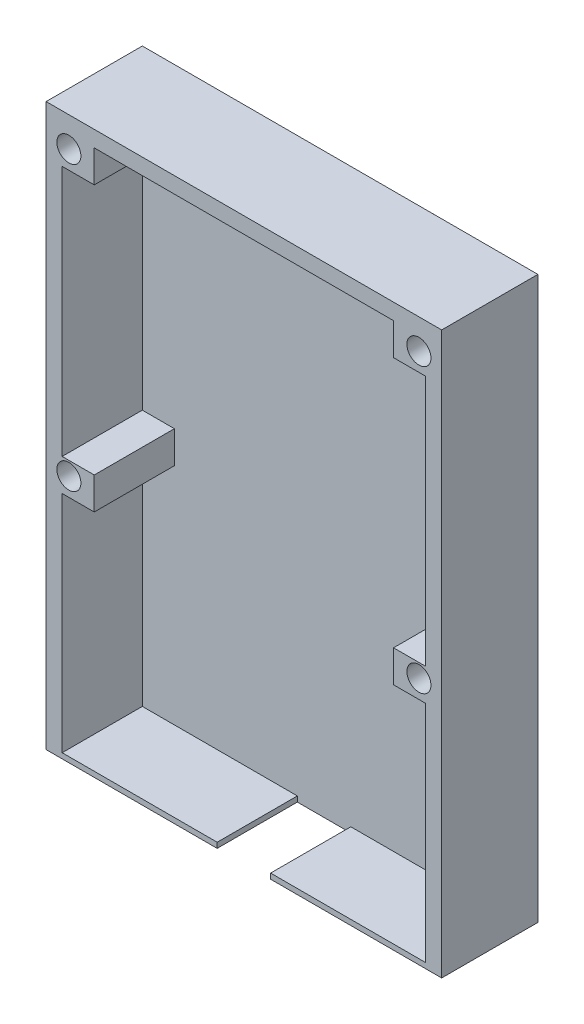
ISO-10303-21;
HEADER;
FILE_DESCRIPTION(('STEP AP214'),'2;1');
FILE_NAME('part.step','',(''),(''),'','','');
FILE_SCHEMA(('AUTOMOTIVE_DESIGN { 1 0 10303 214 1 1 1 1 }'));
ENDSEC;
DATA;
#1=APPLICATION_CONTEXT('core data for automotive mechanical design processes');
#2=APPLICATION_PROTOCOL_DEFINITION('international standard','automotive_design',2000,#1);
#3=PRODUCT_CONTEXT('',#1,'mechanical');
#4=PRODUCT('Part','Part','',(#3));
#5=PRODUCT_RELATED_PRODUCT_CATEGORY('part','',(#4));
#6=PRODUCT_DEFINITION_FORMATION('','',#4);
#7=PRODUCT_DEFINITION_CONTEXT('part definition',#1,'design');
#8=PRODUCT_DEFINITION('design','',#6,#7);
#9=PRODUCT_DEFINITION_SHAPE('','',#8);
#10=(LENGTH_UNIT() NAMED_UNIT(*) SI_UNIT(.MILLI.,.METRE.));
#11=(NAMED_UNIT(*) PLANE_ANGLE_UNIT() SI_UNIT($,.RADIAN.));
#12=(NAMED_UNIT(*) SI_UNIT($,.STERADIAN.) SOLID_ANGLE_UNIT());
#13=UNCERTAINTY_MEASURE_WITH_UNIT(LENGTH_MEASURE(1.E-05),#10,'distance_accuracy_value','');
#14=(GEOMETRIC_REPRESENTATION_CONTEXT(3) GLOBAL_UNCERTAINTY_ASSIGNED_CONTEXT((#13)) GLOBAL_UNIT_ASSIGNED_CONTEXT((#10,
#11,#12)) REPRESENTATION_CONTEXT('',''));
#15=CARTESIAN_POINT('',(0.,0.,0.));
#16=DIRECTION('',(0.,0.,1.));
#17=DIRECTION('',(1.,0.,0.));
#18=AXIS2_PLACEMENT_3D('',#15,#16,#17);
#19=CARTESIAN_POINT('',(0.,0.,18.));
#20=DIRECTION('',(0.,0.,-1.));
#21=DIRECTION('',(-1.,0.,0.));
#22=AXIS2_PLACEMENT_3D('',#19,#20,#21);
#23=PLANE('',#22);
#24=CARTESIAN_POINT('',(32.7450762059556,46.9267514757554,18.));
#25=DIRECTION('',(0.,0.,1.));
#26=DIRECTION('',(1.,0.,0.));
#27=AXIS2_PLACEMENT_3D('',#24,#25,#26);
#28=CIRCLE('',#27,2.24999999999999);
#29=CARTESIAN_POINT('',(34.9950762059556,46.9267514757554,18.));
#30=VERTEX_POINT('',#29);
#31=EDGE_CURVE('E267',#30,#30,#28,.T.);
#32=ORIENTED_EDGE('',*,*,#31,.F.);
#33=EDGE_LOOP('',(#32));
#34=FACE_BOUND('',#33,.T.);
#35=DIRECTION('',(0.,1.,0.));
#36=VECTOR('',#35,1.);
#37=CARTESIAN_POINT('',(34.,-49.5,18.));
#38=LINE('',#37,#36);
#39=CARTESIAN_POINT('',(34.,-51.5,18.));
#40=VERTEX_POINT('',#39);
#41=CARTESIAN_POINT('',(34.,-9.49999999999999,18.));
#42=VERTEX_POINT('',#41);
#43=EDGE_CURVE('E352',#40,#42,#38,.T.);
#44=ORIENTED_EDGE('',*,*,#43,.F.);
#45=DIRECTION('',(-1.,0.,0.));
#46=VECTOR('',#45,1.);
#47=CARTESIAN_POINT('',(0.,-51.5,18.));
#48=LINE('',#47,#46);
#49=CARTESIAN_POINT('',(5.,-51.5,18.));
#50=VERTEX_POINT('',#49);
#51=EDGE_CURVE('E208',#40,#50,#48,.T.);
#52=ORIENTED_EDGE('',*,*,#51,.T.);
#53=DIRECTION('',(0.,-1.,0.));
#54=VECTOR('',#53,1.);
#55=CARTESIAN_POINT('',(5.,0.,18.));
#56=LINE('',#55,#54);
#57=CARTESIAN_POINT('',(5.,-52.5,18.));
#58=VERTEX_POINT('',#57);
#59=EDGE_CURVE('E323',#50,#58,#56,.T.);
#60=ORIENTED_EDGE('',*,*,#59,.T.);
#61=DIRECTION('',(1.,0.,0.));
#62=VECTOR('',#61,1.);
#63=CARTESIAN_POINT('',(-37.,-52.5,18.));
#64=LINE('',#63,#62);
#65=CARTESIAN_POINT('',(37.,-52.5,18.));
#66=VERTEX_POINT('',#65);
#67=EDGE_CURVE('E370',#58,#66,#64,.T.);
#68=ORIENTED_EDGE('',*,*,#67,.T.);
#69=DIRECTION('',(0.,1.,0.));
#70=VECTOR('',#69,1.);
#71=CARTESIAN_POINT('',(37.,-52.5,18.));
#72=LINE('',#71,#70);
#73=CARTESIAN_POINT('',(37.,52.5,18.));
#74=VERTEX_POINT('',#73);
#75=EDGE_CURVE('E362',#66,#74,#72,.T.);
#76=ORIENTED_EDGE('',*,*,#75,.T.);
#77=DIRECTION('',(-1.,0.,0.));
#78=VECTOR('',#77,1.);
#79=CARTESIAN_POINT('',(-37.,52.5,18.));
#80=LINE('',#79,#78);
#81=CARTESIAN_POINT('',(-37.,52.5,18.));
#82=VERTEX_POINT('',#81);
#83=EDGE_CURVE('E365',#74,#82,#80,.T.);
#84=ORIENTED_EDGE('',*,*,#83,.T.);
#85=DIRECTION('',(0.,-1.,0.));
#86=VECTOR('',#85,1.);
#87=CARTESIAN_POINT('',(-37.,-52.5,18.));
#88=LINE('',#87,#86);
#89=CARTESIAN_POINT('',(-37.,-52.5,18.));
#90=VERTEX_POINT('',#89);
#91=EDGE_CURVE('E368',#82,#90,#88,.T.);
#92=ORIENTED_EDGE('',*,*,#91,.T.);
#93=CARTESIAN_POINT('',(-5.,-52.5,18.));
#94=VERTEX_POINT('',#93);
#95=EDGE_CURVE('E371',#90,#94,#64,.T.);
#96=ORIENTED_EDGE('',*,*,#95,.T.);
#97=DIRECTION('',(0.,1.,0.));
#98=VECTOR('',#97,1.);
#99=CARTESIAN_POINT('',(-5.,0.,18.));
#100=LINE('',#99,#98);
#101=CARTESIAN_POINT('',(-5.,-51.5,18.));
#102=VERTEX_POINT('',#101);
#103=EDGE_CURVE('E319',#94,#102,#100,.T.);
#104=ORIENTED_EDGE('',*,*,#103,.T.);
#105=CARTESIAN_POINT('',(-34.,-51.5,18.));
#106=VERTEX_POINT('',#105);
#107=EDGE_CURVE('E56',#102,#106,#48,.T.);
#108=ORIENTED_EDGE('',*,*,#107,.T.);
#109=DIRECTION('',(0.,-1.,0.));
#110=VECTOR('',#109,1.);
#111=CARTESIAN_POINT('',(-34.,49.5,18.));
#112=LINE('',#111,#110);
#113=CARTESIAN_POINT('',(-34.,-9.49999999999999,18.));
#114=VERTEX_POINT('',#113);
#115=EDGE_CURVE('E357',#114,#106,#112,.T.);
#116=ORIENTED_EDGE('',*,*,#115,.F.);
#117=DIRECTION('',(1.,0.,0.));
#118=VECTOR('',#117,1.);
#119=CARTESIAN_POINT('',(-34.,-9.49999999999999,18.));
#120=LINE('',#119,#118);
#121=CARTESIAN_POINT('',(-28.,-9.49999999999999,18.));
#122=VERTEX_POINT('',#121);
#123=EDGE_CURVE('E229',#114,#122,#120,.T.);
#124=ORIENTED_EDGE('',*,*,#123,.T.);
#125=DIRECTION('',(0.,1.,0.));
#126=VECTOR('',#125,1.);
#127=CARTESIAN_POINT('',(-28.,-3.49999999999999,18.));
#128=LINE('',#127,#126);
#129=CARTESIAN_POINT('',(-28.,-3.49999999999999,18.));
#130=VERTEX_POINT('',#129);
#131=EDGE_CURVE('E238',#122,#130,#128,.T.);
#132=ORIENTED_EDGE('',*,*,#131,.T.);
#133=DIRECTION('',(-1.,0.,0.));
#134=VECTOR('',#133,1.);
#135=CARTESIAN_POINT('',(-34.,-3.50000000000001,18.));
#136=LINE('',#135,#134);
#137=CARTESIAN_POINT('',(-34.,-3.49999999999999,18.));
#138=VERTEX_POINT('',#137);
#139=EDGE_CURVE('E241',#130,#138,#136,.T.);
#140=ORIENTED_EDGE('',*,*,#139,.T.);
#141=CARTESIAN_POINT('',(-34.,43.5,18.));
#142=VERTEX_POINT('',#141);
#143=EDGE_CURVE('E358',#142,#138,#112,.T.);
#144=ORIENTED_EDGE('',*,*,#143,.F.);
#145=DIRECTION('',(1.,0.,0.));
#146=VECTOR('',#145,1.);
#147=CARTESIAN_POINT('',(-34.,43.5,18.));
#148=LINE('',#147,#146);
#149=CARTESIAN_POINT('',(-28.,43.5,18.));
#150=VERTEX_POINT('',#149);
#151=EDGE_CURVE('E331',#142,#150,#148,.T.);
#152=ORIENTED_EDGE('',*,*,#151,.T.);
#153=DIRECTION('',(0.,1.,0.));
#154=VECTOR('',#153,1.);
#155=CARTESIAN_POINT('',(-28.,49.5,18.));
#156=LINE('',#155,#154);
#157=CARTESIAN_POINT('',(-28.,49.5,18.));
#158=VERTEX_POINT('',#157);
#159=EDGE_CURVE('E338',#150,#158,#156,.T.);
#160=ORIENTED_EDGE('',*,*,#159,.T.);
#161=DIRECTION('',(-1.,0.,0.));
#162=VECTOR('',#161,1.);
#163=CARTESIAN_POINT('',(34.,49.5,18.));
#164=LINE('',#163,#162);
#165=CARTESIAN_POINT('',(28.,49.5,18.));
#166=VERTEX_POINT('',#165);
#167=EDGE_CURVE('E348',#166,#158,#164,.T.);
#168=ORIENTED_EDGE('',*,*,#167,.F.);
#169=DIRECTION('',(0.,1.,0.));
#170=VECTOR('',#169,1.);
#171=CARTESIAN_POINT('',(28.,49.5,18.));
#172=LINE('',#171,#170);
#173=CARTESIAN_POINT('',(28.,43.5,18.));
#174=VERTEX_POINT('',#173);
#175=EDGE_CURVE('E291',#174,#166,#172,.T.);
#176=ORIENTED_EDGE('',*,*,#175,.F.);
#177=DIRECTION('',(-1.,0.,0.));
#178=VECTOR('',#177,1.);
#179=CARTESIAN_POINT('',(34.,43.5,18.));
#180=LINE('',#179,#178);
#181=CARTESIAN_POINT('',(34.,43.5,18.));
#182=VERTEX_POINT('',#181);
#183=EDGE_CURVE('E300',#182,#174,#180,.T.);
#184=ORIENTED_EDGE('',*,*,#183,.F.);
#185=CARTESIAN_POINT('',(34.,-3.50000000000001,18.));
#186=VERTEX_POINT('',#185);
#187=EDGE_CURVE('E360',#186,#182,#38,.T.);
#188=ORIENTED_EDGE('',*,*,#187,.F.);
#189=DIRECTION('',(1.,0.,0.));
#190=VECTOR('',#189,1.);
#191=CARTESIAN_POINT('',(34.,-3.50000000000001,18.));
#192=LINE('',#191,#190);
#193=CARTESIAN_POINT('',(28.,-3.49999999999999,18.));
#194=VERTEX_POINT('',#193);
#195=EDGE_CURVE('E260',#194,#186,#192,.T.);
#196=ORIENTED_EDGE('',*,*,#195,.F.);
#197=DIRECTION('',(0.,1.,0.));
#198=VECTOR('',#197,1.);
#199=CARTESIAN_POINT('',(28.,-3.49999999999999,18.));
#200=LINE('',#199,#198);
#201=CARTESIAN_POINT('',(28.,-9.49999999999999,18.));
#202=VERTEX_POINT('',#201);
#203=EDGE_CURVE('E270',#202,#194,#200,.T.);
#204=ORIENTED_EDGE('',*,*,#203,.F.);
#205=DIRECTION('',(-1.,0.,0.));
#206=VECTOR('',#205,1.);
#207=CARTESIAN_POINT('',(34.,-9.49999999999999,18.));
#208=LINE('',#207,#206);
#209=EDGE_CURVE('E273',#42,#202,#208,.T.);
#210=ORIENTED_EDGE('',*,*,#209,.F.);
#211=EDGE_LOOP('',(#44,#52,#60,#68,#76,#84,#92,#96,#104,#108,#116,#124,#132,#140,#144,#152,#160,
#168,#176,#184,#188,#196,#204,#210));
#212=FACE_BOUND('',#211,.T.);
#213=CARTESIAN_POINT('',(-32.7450762059556,46.9267514757554,18.));
#214=DIRECTION('',(0.,0.,1.));
#215=DIRECTION('',(1.,0.,0.));
#216=AXIS2_PLACEMENT_3D('',#213,#214,#215);
#217=CIRCLE('',#216,2.24999999999999);
#218=CARTESIAN_POINT('',(-30.4950762059556,46.9267514757554,18.));
#219=VERTEX_POINT('',#218);
#220=EDGE_CURVE('E325',#219,#219,#217,.T.);
#221=ORIENTED_EDGE('',*,*,#220,.F.);
#222=EDGE_LOOP('',(#221));
#223=FACE_BOUND('',#222,.T.);
#224=CARTESIAN_POINT('',(32.7450762059556,-6.07324852424457,18.));
#225=DIRECTION('',(0.,0.,1.));
#226=DIRECTION('',(1.,0.,0.));
#227=AXIS2_PLACEMENT_3D('',#224,#225,#226);
#228=CIRCLE('',#227,2.24999999999999);
#229=CARTESIAN_POINT('',(34.9950762059556,-6.07324852424457,18.));
#230=VERTEX_POINT('',#229);
#231=EDGE_CURVE('E254',#230,#230,#228,.T.);
#232=ORIENTED_EDGE('',*,*,#231,.F.);
#233=EDGE_LOOP('',(#232));
#234=FACE_BOUND('',#233,.T.);
#235=CARTESIAN_POINT('',(-32.7450762059556,-6.07324852424457,18.));
#236=DIRECTION('',(0.,0.,1.));
#237=DIRECTION('',(1.,0.,0.));
#238=AXIS2_PLACEMENT_3D('',#235,#236,#237);
#239=CIRCLE('',#238,2.24999999999999);
#240=CARTESIAN_POINT('',(-30.4950762059556,-6.07324852424457,18.));
#241=VERTEX_POINT('',#240);
#242=EDGE_CURVE('E223',#241,#241,#239,.T.);
#243=ORIENTED_EDGE('',*,*,#242,.F.);
#244=EDGE_LOOP('',(#243));
#245=FACE_BOUND('',#244,.T.);
#246=ADVANCED_FACE('F33',(#34,#212,#223,#234,#245),#23,.F.);
#247=CARTESIAN_POINT('',(-34.,49.5,3.));
#248=DIRECTION('',(-1.,0.,0.));
#249=DIRECTION('',(0.,0.,1.));
#250=AXIS2_PLACEMENT_3D('',#247,#248,#249);
#251=PLANE('',#250);
#252=ORIENTED_EDGE('',*,*,#143,.T.);
#253=DIRECTION('',(0.,0.,1.));
#254=VECTOR('',#253,1.);
#255=CARTESIAN_POINT('',(-34.,-3.50000000000001,-5.48528137423858));
#256=LINE('',#255,#254);
#257=CARTESIAN_POINT('',(-34.,-3.49999999999999,3.));
#258=VERTEX_POINT('',#257);
#259=EDGE_CURVE('E233',#258,#138,#256,.T.);
#260=ORIENTED_EDGE('',*,*,#259,.F.);
#261=DIRECTION('',(0.,-1.,0.));
#262=VECTOR('',#261,1.);
#263=CARTESIAN_POINT('',(-34.,49.5,3.));
#264=LINE('',#263,#262);
#265=CARTESIAN_POINT('',(-34.,43.5,3.));
#266=VERTEX_POINT('',#265);
#267=EDGE_CURVE('E353',#266,#258,#264,.T.);
#268=ORIENTED_EDGE('',*,*,#267,.F.);
#269=DIRECTION('',(0.,0.,1.));
#270=VECTOR('',#269,1.);
#271=CARTESIAN_POINT('',(-34.,43.5,-5.48528137423858));
#272=LINE('',#271,#270);
#273=EDGE_CURVE('E341',#266,#142,#272,.T.);
#274=ORIENTED_EDGE('',*,*,#273,.T.);
#275=EDGE_LOOP('',(#252,#260,#268,#274));
#276=FACE_BOUND('',#275,.T.);
#277=ADVANCED_FACE('F496',(#276),#251,.F.);
#278=CARTESIAN_POINT('',(0.,0.,0.));
#279=DIRECTION('',(0.,0.,-1.));
#280=DIRECTION('',(-1.,0.,0.));
#281=AXIS2_PLACEMENT_3D('',#278,#279,#280);
#282=PLANE('',#281);
#283=CARTESIAN_POINT('',(-32.7450762059556,-6.07324852424457,0.));
#284=DIRECTION('',(0.,0.,1.));
#285=DIRECTION('',(1.,0.,0.));
#286=AXIS2_PLACEMENT_3D('',#283,#284,#285);
#287=CIRCLE('',#286,2.25);
#288=CARTESIAN_POINT('',(-30.4950762059556,-6.07324852424457,0.));
#289=VERTEX_POINT('',#288);
#290=EDGE_CURVE('E226',#289,#289,#287,.T.);
#291=ORIENTED_EDGE('',*,*,#290,.T.);
#292=EDGE_LOOP('',(#291));
#293=FACE_BOUND('',#292,.T.);
#294=DIRECTION('',(0.,1.,0.));
#295=VECTOR('',#294,1.);
#296=CARTESIAN_POINT('',(37.,-52.5,0.));
#297=LINE('',#296,#295);
#298=CARTESIAN_POINT('',(37.,-52.5,0.));
#299=VERTEX_POINT('',#298);
#300=CARTESIAN_POINT('',(37.,52.5,0.));
#301=VERTEX_POINT('',#300);
#302=EDGE_CURVE('E202',#299,#301,#297,.T.);
#303=ORIENTED_EDGE('',*,*,#302,.F.);
#304=DIRECTION('',(1.,0.,0.));
#305=VECTOR('',#304,1.);
#306=CARTESIAN_POINT('',(-37.,-52.5,0.));
#307=LINE('',#306,#305);
#308=CARTESIAN_POINT('',(-37.,-52.5,0.));
#309=VERTEX_POINT('',#308);
#310=EDGE_CURVE('E366',#309,#299,#307,.T.);
#311=ORIENTED_EDGE('',*,*,#310,.F.);
#312=DIRECTION('',(0.,-1.,0.));
#313=VECTOR('',#312,1.);
#314=CARTESIAN_POINT('',(-37.,-52.5,0.));
#315=LINE('',#314,#313);
#316=CARTESIAN_POINT('',(-37.,52.5,0.));
#317=VERTEX_POINT('',#316);
#318=EDGE_CURVE('E379',#317,#309,#315,.T.);
#319=ORIENTED_EDGE('',*,*,#318,.F.);
#320=DIRECTION('',(-1.,0.,0.));
#321=VECTOR('',#320,1.);
#322=CARTESIAN_POINT('',(-37.,52.5,0.));
#323=LINE('',#322,#321);
#324=EDGE_CURVE('E377',#301,#317,#323,.T.);
#325=ORIENTED_EDGE('',*,*,#324,.F.);
#326=EDGE_LOOP('',(#303,#311,#319,#325));
#327=FACE_BOUND('',#326,.T.);
#328=CARTESIAN_POINT('',(-32.7450762059556,46.9267514757554,0.));
#329=DIRECTION('',(0.,0.,1.));
#330=DIRECTION('',(1.,0.,0.));
#331=AXIS2_PLACEMENT_3D('',#328,#329,#330);
#332=CIRCLE('',#331,2.25);
#333=CARTESIAN_POINT('',(-30.4950762059556,46.9267514757554,0.));
#334=VERTEX_POINT('',#333);
#335=EDGE_CURVE('E328',#334,#334,#332,.T.);
#336=ORIENTED_EDGE('',*,*,#335,.T.);
#337=EDGE_LOOP('',(#336));
#338=FACE_BOUND('',#337,.T.);
#339=CARTESIAN_POINT('',(32.7450762059556,46.9267514757554,0.));
#340=DIRECTION('',(0.,0.,1.));
#341=DIRECTION('',(1.,0.,0.));
#342=AXIS2_PLACEMENT_3D('',#339,#340,#341);
#343=CIRCLE('',#342,2.25);
#344=CARTESIAN_POINT('',(34.9950762059556,46.9267514757554,0.));
#345=VERTEX_POINT('',#344);
#346=EDGE_CURVE('E288',#345,#345,#343,.T.);
#347=ORIENTED_EDGE('',*,*,#346,.T.);
#348=EDGE_LOOP('',(#347));
#349=FACE_BOUND('',#348,.T.);
#350=CARTESIAN_POINT('',(32.7450762059556,-6.07324852424457,0.));
#351=DIRECTION('',(0.,0.,1.));
#352=DIRECTION('',(1.,0.,0.));
#353=AXIS2_PLACEMENT_3D('',#350,#351,#352);
#354=CIRCLE('',#353,2.25);
#355=CARTESIAN_POINT('',(34.9950762059556,-6.07324852424457,0.));
#356=VERTEX_POINT('',#355);
#357=EDGE_CURVE('E257',#356,#356,#354,.T.);
#358=ORIENTED_EDGE('',*,*,#357,.T.);
#359=EDGE_LOOP('',(#358));
#360=FACE_BOUND('',#359,.T.);
#361=ADVANCED_FACE('F400',(#293,#327,#338,#349,#360),#282,.T.);
#362=CARTESIAN_POINT('',(34.,-49.5,3.));
#363=DIRECTION('',(1.,0.,0.));
#364=DIRECTION('',(0.,0.,-1.));
#365=AXIS2_PLACEMENT_3D('',#362,#363,#364);
#366=PLANE('',#365);
#367=DIRECTION('',(0.,0.,1.));
#368=VECTOR('',#367,1.);
#369=CARTESIAN_POINT('',(34.,-3.50000000000001,-5.48528137423858));
#370=LINE('',#369,#368);
#371=CARTESIAN_POINT('',(34.,-3.50000000000001,3.));
#372=VERTEX_POINT('',#371);
#373=EDGE_CURVE('E276',#372,#186,#370,.T.);
#374=ORIENTED_EDGE('',*,*,#373,.T.);
#375=ORIENTED_EDGE('',*,*,#187,.T.);
#376=DIRECTION('',(0.,0.,1.));
#377=VECTOR('',#376,1.);
#378=CARTESIAN_POINT('',(34.,43.5,-5.48528137423858));
#379=LINE('',#378,#377);
#380=CARTESIAN_POINT('',(34.,43.5,3.));
#381=VERTEX_POINT('',#380);
#382=EDGE_CURVE('E295',#381,#182,#379,.T.);
#383=ORIENTED_EDGE('',*,*,#382,.F.);
#384=DIRECTION('',(0.,1.,0.));
#385=VECTOR('',#384,1.);
#386=CARTESIAN_POINT('',(34.,-49.5,3.));
#387=LINE('',#386,#385);
#388=EDGE_CURVE('E203',#372,#381,#387,.T.);
#389=ORIENTED_EDGE('',*,*,#388,.F.);
#390=EDGE_LOOP('',(#374,#375,#383,#389));
#391=FACE_BOUND('',#390,.T.);
#392=ADVANCED_FACE('F472',(#391),#366,.F.);
#393=DIRECTION('',(0.,0.,1.));
#394=VECTOR('',#393,1.);
#395=CARTESIAN_POINT('',(34.,-9.49999999999999,-5.48528137423858));
#396=LINE('',#395,#394);
#397=CARTESIAN_POINT('',(34.,-9.49999999999999,3.));
#398=VERTEX_POINT('',#397);
#399=EDGE_CURVE('E199',#398,#42,#396,.T.);
#400=ORIENTED_EDGE('',*,*,#399,.F.);
#401=CARTESIAN_POINT('',(34.,-51.5,3.));
#402=VERTEX_POINT('',#401);
#403=EDGE_CURVE('E195',#402,#398,#387,.T.);
#404=ORIENTED_EDGE('',*,*,#403,.F.);
#405=DIRECTION('',(0.,0.,-1.));
#406=VECTOR('',#405,1.);
#407=CARTESIAN_POINT('',(34.,-51.5,3.));
#408=LINE('',#407,#406);
#409=EDGE_CURVE('E197',#40,#402,#408,.T.);
#410=ORIENTED_EDGE('',*,*,#409,.F.);
#411=ORIENTED_EDGE('',*,*,#43,.T.);
#412=EDGE_LOOP('',(#400,#404,#410,#411));
#413=FACE_BOUND('',#412,.T.);
#414=ADVANCED_FACE('F196',(#413),#366,.F.);
#415=CARTESIAN_POINT('',(0.,0.,3.));
#416=DIRECTION('',(0.,0.,1.));
#417=DIRECTION('',(1.,0.,0.));
#418=AXIS2_PLACEMENT_3D('',#415,#416,#417);
#419=PLANE('',#418);
#420=DIRECTION('',(0.,-1.,0.));
#421=VECTOR('',#420,1.);
#422=CARTESIAN_POINT('',(5.,-37.5,3.));
#423=LINE('',#422,#421);
#424=CARTESIAN_POINT('',(5.,-51.5,3.));
#425=VERTEX_POINT('',#424);
#426=CARTESIAN_POINT('',(5.,-52.5,3.));
#427=VERTEX_POINT('',#426);
#428=EDGE_CURVE('E214',#425,#427,#423,.T.);
#429=ORIENTED_EDGE('',*,*,#428,.F.);
#430=DIRECTION('',(-1.,0.,0.));
#431=VECTOR('',#430,1.);
#432=CARTESIAN_POINT('',(34.,-51.5,3.));
#433=LINE('',#432,#431);
#434=EDGE_CURVE('E48',#402,#425,#433,.T.);
#435=ORIENTED_EDGE('',*,*,#434,.F.);
#436=ORIENTED_EDGE('',*,*,#403,.T.);
#437=DIRECTION('',(1.,0.,0.));
#438=VECTOR('',#437,1.);
#439=CARTESIAN_POINT('',(34.,-9.49999999999999,3.));
#440=LINE('',#439,#438);
#441=CARTESIAN_POINT('',(28.,-9.49999999999999,3.));
#442=VERTEX_POINT('',#441);
#443=EDGE_CURVE('E264',#442,#398,#440,.T.);
#444=ORIENTED_EDGE('',*,*,#443,.F.);
#445=DIRECTION('',(0.,-1.,0.));
#446=VECTOR('',#445,1.);
#447=CARTESIAN_POINT('',(28.,-3.49999999999999,3.));
#448=LINE('',#447,#446);
#449=CARTESIAN_POINT('',(28.,-3.49999999999999,3.));
#450=VERTEX_POINT('',#449);
#451=EDGE_CURVE('E261',#450,#442,#448,.T.);
#452=ORIENTED_EDGE('',*,*,#451,.F.);
#453=DIRECTION('',(-1.,0.,0.));
#454=VECTOR('',#453,1.);
#455=CARTESIAN_POINT('',(34.,-3.50000000000001,3.));
#456=LINE('',#455,#454);
#457=EDGE_CURVE('E265',#372,#450,#456,.T.);
#458=ORIENTED_EDGE('',*,*,#457,.F.);
#459=ORIENTED_EDGE('',*,*,#388,.T.);
#460=DIRECTION('',(1.,0.,0.));
#461=VECTOR('',#460,1.);
#462=CARTESIAN_POINT('',(34.,43.5,3.));
#463=LINE('',#462,#461);
#464=CARTESIAN_POINT('',(28.,43.5,3.));
#465=VERTEX_POINT('',#464);
#466=EDGE_CURVE('E294',#465,#381,#463,.T.);
#467=ORIENTED_EDGE('',*,*,#466,.F.);
#468=DIRECTION('',(0.,-1.,0.));
#469=VECTOR('',#468,1.);
#470=CARTESIAN_POINT('',(28.,49.5,3.));
#471=LINE('',#470,#469);
#472=CARTESIAN_POINT('',(28.,49.5,3.));
#473=VERTEX_POINT('',#472);
#474=EDGE_CURVE('E292',#473,#465,#471,.T.);
#475=ORIENTED_EDGE('',*,*,#474,.F.);
#476=DIRECTION('',(-1.,0.,0.));
#477=VECTOR('',#476,1.);
#478=CARTESIAN_POINT('',(34.,49.5,3.));
#479=LINE('',#478,#477);
#480=CARTESIAN_POINT('',(-28.,49.5,3.));
#481=VERTEX_POINT('',#480);
#482=EDGE_CURVE('E349',#473,#481,#479,.T.);
#483=ORIENTED_EDGE('',*,*,#482,.T.);
#484=DIRECTION('',(0.,-1.,0.));
#485=VECTOR('',#484,1.);
#486=CARTESIAN_POINT('',(-28.,49.5,3.));
#487=LINE('',#486,#485);
#488=CARTESIAN_POINT('',(-28.,43.5,3.));
#489=VERTEX_POINT('',#488);
#490=EDGE_CURVE('E332',#481,#489,#487,.T.);
#491=ORIENTED_EDGE('',*,*,#490,.T.);
#492=DIRECTION('',(-1.,0.,0.));
#493=VECTOR('',#492,1.);
#494=CARTESIAN_POINT('',(-34.,43.5,3.));
#495=LINE('',#494,#493);
#496=EDGE_CURVE('E334',#489,#266,#495,.T.);
#497=ORIENTED_EDGE('',*,*,#496,.T.);
#498=ORIENTED_EDGE('',*,*,#267,.T.);
#499=DIRECTION('',(1.,0.,0.));
#500=VECTOR('',#499,1.);
#501=CARTESIAN_POINT('',(-34.,-3.50000000000001,3.));
#502=LINE('',#501,#500);
#503=CARTESIAN_POINT('',(-28.,-3.49999999999999,3.));
#504=VERTEX_POINT('',#503);
#505=EDGE_CURVE('E232',#258,#504,#502,.T.);
#506=ORIENTED_EDGE('',*,*,#505,.T.);
#507=DIRECTION('',(0.,-1.,0.));
#508=VECTOR('',#507,1.);
#509=CARTESIAN_POINT('',(-28.,-3.49999999999999,3.));
#510=LINE('',#509,#508);
#511=CARTESIAN_POINT('',(-28.,-9.49999999999999,3.));
#512=VERTEX_POINT('',#511);
#513=EDGE_CURVE('E230',#504,#512,#510,.T.);
#514=ORIENTED_EDGE('',*,*,#513,.T.);
#515=DIRECTION('',(-1.,0.,0.));
#516=VECTOR('',#515,1.);
#517=CARTESIAN_POINT('',(-34.,-9.49999999999999,3.));
#518=LINE('',#517,#516);
#519=CARTESIAN_POINT('',(-34.,-9.49999999999999,3.));
#520=VERTEX_POINT('',#519);
#521=EDGE_CURVE('E235',#512,#520,#518,.T.);
#522=ORIENTED_EDGE('',*,*,#521,.T.);
#523=CARTESIAN_POINT('',(-34.,-51.5,3.));
#524=VERTEX_POINT('',#523);
#525=EDGE_CURVE('E351',#520,#524,#264,.T.);
#526=ORIENTED_EDGE('',*,*,#525,.T.);
#527=CARTESIAN_POINT('',(-5.,-51.5,3.));
#528=VERTEX_POINT('',#527);
#529=EDGE_CURVE('E209',#528,#524,#433,.T.);
#530=ORIENTED_EDGE('',*,*,#529,.F.);
#531=DIRECTION('',(0.,-1.,0.));
#532=VECTOR('',#531,1.);
#533=CARTESIAN_POINT('',(-5.,-37.5,3.));
#534=LINE('',#533,#532);
#535=CARTESIAN_POINT('',(-5.,-52.5,3.));
#536=VERTEX_POINT('',#535);
#537=EDGE_CURVE('E317',#528,#536,#534,.T.);
#538=ORIENTED_EDGE('',*,*,#537,.T.);
#539=DIRECTION('',(1.,0.,0.));
#540=VECTOR('',#539,1.);
#541=CARTESIAN_POINT('',(-5.,-52.5,3.));
#542=LINE('',#541,#540);
#543=EDGE_CURVE('E315',#536,#427,#542,.T.);
#544=ORIENTED_EDGE('',*,*,#543,.T.);
#545=EDGE_LOOP('',(#429,#435,#436,#444,#452,#458,#459,#467,#475,#483,#491,#497,#498,#506,#514,
#522,#526,#530,#538,#544));
#546=FACE_BOUND('',#545,.T.);
#547=ADVANCED_FACE('F212',(#546),#419,.T.);
#548=CARTESIAN_POINT('',(34.,49.5,3.));
#549=DIRECTION('',(0.,1.,0.));
#550=DIRECTION('',(0.,0.,1.));
#551=AXIS2_PLACEMENT_3D('',#548,#549,#550);
#552=PLANE('',#551);
#553=DIRECTION('',(0.,0.,1.));
#554=VECTOR('',#553,1.);
#555=CARTESIAN_POINT('',(28.,49.5,-5.48528137423858));
#556=LINE('',#555,#554);
#557=EDGE_CURVE('E303',#473,#166,#556,.T.);
#558=ORIENTED_EDGE('',*,*,#557,.T.);
#559=ORIENTED_EDGE('',*,*,#167,.T.);
#560=DIRECTION('',(0.,0.,1.));
#561=VECTOR('',#560,1.);
#562=CARTESIAN_POINT('',(-28.,49.5,-5.48528137423858));
#563=LINE('',#562,#561);
#564=EDGE_CURVE('E335',#481,#158,#563,.T.);
#565=ORIENTED_EDGE('',*,*,#564,.F.);
#566=ORIENTED_EDGE('',*,*,#482,.F.);
#567=EDGE_LOOP('',(#558,#559,#565,#566));
#568=FACE_BOUND('',#567,.T.);
#569=ADVANCED_FACE('F460',(#568),#552,.F.);
#570=CARTESIAN_POINT('',(37.,-52.5,18.));
#571=DIRECTION('',(-1.,0.,0.));
#572=DIRECTION('',(0.,0.,1.));
#573=AXIS2_PLACEMENT_3D('',#570,#571,#572);
#574=PLANE('',#573);
#575=ORIENTED_EDGE('',*,*,#302,.T.);
#576=DIRECTION('',(0.,0.,-1.));
#577=VECTOR('',#576,1.);
#578=CARTESIAN_POINT('',(37.,52.5,18.));
#579=LINE('',#578,#577);
#580=EDGE_CURVE('E41',#74,#301,#579,.T.);
#581=ORIENTED_EDGE('',*,*,#580,.F.);
#582=ORIENTED_EDGE('',*,*,#75,.F.);
#583=DIRECTION('',(0.,0.,-1.));
#584=VECTOR('',#583,1.);
#585=CARTESIAN_POINT('',(37.,-52.5,18.));
#586=LINE('',#585,#584);
#587=EDGE_CURVE('E374',#66,#299,#586,.T.);
#588=ORIENTED_EDGE('',*,*,#587,.T.);
#589=EDGE_LOOP('',(#575,#581,#582,#588));
#590=FACE_BOUND('',#589,.T.);
#591=ADVANCED_FACE('F35',(#590),#574,.F.);
#592=CARTESIAN_POINT('',(-37.,52.5,18.));
#593=DIRECTION('',(0.,-1.,0.));
#594=DIRECTION('',(0.,0.,-1.));
#595=AXIS2_PLACEMENT_3D('',#592,#593,#594);
#596=PLANE('',#595);
#597=ORIENTED_EDGE('',*,*,#324,.T.);
#598=DIRECTION('',(0.,0.,-1.));
#599=VECTOR('',#598,1.);
#600=CARTESIAN_POINT('',(-37.,52.5,18.));
#601=LINE('',#600,#599);
#602=EDGE_CURVE('E387',#82,#317,#601,.T.);
#603=ORIENTED_EDGE('',*,*,#602,.F.);
#604=ORIENTED_EDGE('',*,*,#83,.F.);
#605=ORIENTED_EDGE('',*,*,#580,.T.);
#606=EDGE_LOOP('',(#597,#603,#604,#605));
#607=FACE_BOUND('',#606,.T.);
#608=ADVANCED_FACE('F392',(#607),#596,.F.);
#609=CARTESIAN_POINT('',(-37.,-52.5,18.));
#610=DIRECTION('',(1.,0.,0.));
#611=DIRECTION('',(0.,0.,-1.));
#612=AXIS2_PLACEMENT_3D('',#609,#610,#611);
#613=PLANE('',#612);
#614=ORIENTED_EDGE('',*,*,#318,.T.);
#615=DIRECTION('',(0.,0.,-1.));
#616=VECTOR('',#615,1.);
#617=CARTESIAN_POINT('',(-37.,-52.5,18.));
#618=LINE('',#617,#616);
#619=EDGE_CURVE('E384',#90,#309,#618,.T.);
#620=ORIENTED_EDGE('',*,*,#619,.F.);
#621=ORIENTED_EDGE('',*,*,#91,.F.);
#622=ORIENTED_EDGE('',*,*,#602,.T.);
#623=EDGE_LOOP('',(#614,#620,#621,#622));
#624=FACE_BOUND('',#623,.T.);
#625=ADVANCED_FACE('F405',(#624),#613,.F.);
#626=CARTESIAN_POINT('',(-37.,-52.5,18.));
#627=DIRECTION('',(0.,1.,0.));
#628=DIRECTION('',(0.,0.,1.));
#629=AXIS2_PLACEMENT_3D('',#626,#627,#628);
#630=PLANE('',#629);
#631=ORIENTED_EDGE('',*,*,#67,.F.);
#632=DIRECTION('',(0.,0.,1.));
#633=VECTOR('',#632,1.);
#634=CARTESIAN_POINT('',(5.,-52.5,33.));
#635=LINE('',#634,#633);
#636=EDGE_CURVE('E298',#427,#58,#635,.T.);
#637=ORIENTED_EDGE('',*,*,#636,.F.);
#638=ORIENTED_EDGE('',*,*,#543,.F.);
#639=DIRECTION('',(0.,0.,-1.));
#640=VECTOR('',#639,1.);
#641=CARTESIAN_POINT('',(-5.,-52.5,33.));
#642=LINE('',#641,#640);
#643=EDGE_CURVE('E312',#94,#536,#642,.T.);
#644=ORIENTED_EDGE('',*,*,#643,.F.);
#645=ORIENTED_EDGE('',*,*,#95,.F.);
#646=ORIENTED_EDGE('',*,*,#619,.T.);
#647=ORIENTED_EDGE('',*,*,#310,.T.);
#648=ORIENTED_EDGE('',*,*,#587,.F.);
#649=EDGE_LOOP('',(#631,#637,#638,#644,#645,#646,#647,#648));
#650=FACE_BOUND('',#649,.T.);
#651=ADVANCED_FACE('F410',(#650),#630,.F.);
#652=ORIENTED_EDGE('',*,*,#525,.F.);
#653=DIRECTION('',(0.,0.,1.));
#654=VECTOR('',#653,1.);
#655=CARTESIAN_POINT('',(-34.,-9.49999999999999,-5.48528137423858));
#656=LINE('',#655,#654);
#657=EDGE_CURVE('E244',#520,#114,#656,.T.);
#658=ORIENTED_EDGE('',*,*,#657,.T.);
#659=ORIENTED_EDGE('',*,*,#115,.T.);
#660=DIRECTION('',(0.,0.,1.));
#661=VECTOR('',#660,1.);
#662=CARTESIAN_POINT('',(-34.,-51.5,3.));
#663=LINE('',#662,#661);
#664=EDGE_CURVE('E215',#524,#106,#663,.T.);
#665=ORIENTED_EDGE('',*,*,#664,.F.);
#666=EDGE_LOOP('',(#652,#658,#659,#665));
#667=FACE_BOUND('',#666,.T.);
#668=ADVANCED_FACE('F427',(#667),#251,.F.);
#669=CARTESIAN_POINT('',(-28.,49.5,-5.48528137423858));
#670=DIRECTION('',(1.,0.,0.));
#671=DIRECTION('',(0.,1.,0.));
#672=AXIS2_PLACEMENT_3D('',#669,#670,#671);
#673=PLANE('',#672);
#674=ORIENTED_EDGE('',*,*,#490,.F.);
#675=ORIENTED_EDGE('',*,*,#564,.T.);
#676=ORIENTED_EDGE('',*,*,#159,.F.);
#677=DIRECTION('',(0.,0.,1.));
#678=VECTOR('',#677,1.);
#679=CARTESIAN_POINT('',(-28.,43.5,-5.48528137423858));
#680=LINE('',#679,#678);
#681=EDGE_CURVE('E344',#489,#150,#680,.T.);
#682=ORIENTED_EDGE('',*,*,#681,.F.);
#683=EDGE_LOOP('',(#674,#675,#676,#682));
#684=FACE_BOUND('',#683,.T.);
#685=ADVANCED_FACE('F454',(#684),#673,.T.);
#686=CARTESIAN_POINT('',(-34.,43.5,-5.48528137423858));
#687=DIRECTION('',(0.,-1.,0.));
#688=DIRECTION('',(1.,0.,0.));
#689=AXIS2_PLACEMENT_3D('',#686,#687,#688);
#690=PLANE('',#689);
#691=ORIENTED_EDGE('',*,*,#496,.F.);
#692=ORIENTED_EDGE('',*,*,#681,.T.);
#693=ORIENTED_EDGE('',*,*,#151,.F.);
#694=ORIENTED_EDGE('',*,*,#273,.F.);
#695=EDGE_LOOP('',(#691,#692,#693,#694));
#696=FACE_BOUND('',#695,.T.);
#697=ADVANCED_FACE('F449',(#696),#690,.T.);
#698=CARTESIAN_POINT('',(-32.7450762059556,46.9267514757554,18.));
#699=DIRECTION('',(0.,0.,1.));
#700=DIRECTION('',(1.,0.,0.));
#701=AXIS2_PLACEMENT_3D('',#698,#699,#700);
#702=CYLINDRICAL_SURFACE('',#701,2.24999999999999);
#703=ORIENTED_EDGE('',*,*,#335,.F.);
#704=EDGE_LOOP('',(#703));
#705=FACE_BOUND('',#704,.T.);
#706=ORIENTED_EDGE('',*,*,#220,.T.);
#707=EDGE_LOOP('',(#706));
#708=FACE_BOUND('',#707,.T.);
#709=ADVANCED_FACE('F540',(#705,#708),#702,.F.);
#710=CARTESIAN_POINT('',(5.,-37.5,33.));
#711=DIRECTION('',(1.,0.,0.));
#712=DIRECTION('',(0.,0.,-1.));
#713=AXIS2_PLACEMENT_3D('',#710,#711,#712);
#714=PLANE('',#713);
#715=ORIENTED_EDGE('',*,*,#59,.F.);
#716=DIRECTION('',(0.,0.,-1.));
#717=VECTOR('',#716,1.);
#718=CARTESIAN_POINT('',(5.,-51.5,33.));
#719=LINE('',#718,#717);
#720=EDGE_CURVE('E221',#50,#425,#719,.T.);
#721=ORIENTED_EDGE('',*,*,#720,.T.);
#722=ORIENTED_EDGE('',*,*,#428,.T.);
#723=ORIENTED_EDGE('',*,*,#636,.T.);
#724=EDGE_LOOP('',(#715,#721,#722,#723));
#725=FACE_BOUND('',#724,.T.);
#726=ADVANCED_FACE('F418',(#725),#714,.F.);
#727=CARTESIAN_POINT('',(-5.,-37.5,33.));
#728=DIRECTION('',(-1.,0.,0.));
#729=DIRECTION('',(0.,0.,1.));
#730=AXIS2_PLACEMENT_3D('',#727,#728,#729);
#731=PLANE('',#730);
#732=ORIENTED_EDGE('',*,*,#537,.F.);
#733=DIRECTION('',(0.,0.,1.));
#734=VECTOR('',#733,1.);
#735=CARTESIAN_POINT('',(-5.,-51.5,33.));
#736=LINE('',#735,#734);
#737=EDGE_CURVE('E11',#528,#102,#736,.T.);
#738=ORIENTED_EDGE('',*,*,#737,.T.);
#739=ORIENTED_EDGE('',*,*,#103,.F.);
#740=ORIENTED_EDGE('',*,*,#643,.T.);
#741=EDGE_LOOP('',(#732,#738,#739,#740));
#742=FACE_BOUND('',#741,.T.);
#743=ADVANCED_FACE('F422',(#742),#731,.F.);
#744=CARTESIAN_POINT('',(28.,49.5,-5.48528137423858));
#745=DIRECTION('',(1.,0.,0.));
#746=DIRECTION('',(0.,1.,0.));
#747=AXIS2_PLACEMENT_3D('',#744,#745,#746);
#748=PLANE('',#747);
#749=ORIENTED_EDGE('',*,*,#557,.F.);
#750=ORIENTED_EDGE('',*,*,#474,.T.);
#751=DIRECTION('',(0.,0.,1.));
#752=VECTOR('',#751,1.);
#753=CARTESIAN_POINT('',(28.,43.5,-5.48528137423858));
#754=LINE('',#753,#752);
#755=EDGE_CURVE('E306',#465,#174,#754,.T.);
#756=ORIENTED_EDGE('',*,*,#755,.T.);
#757=ORIENTED_EDGE('',*,*,#175,.T.);
#758=EDGE_LOOP('',(#749,#750,#756,#757));
#759=FACE_BOUND('',#758,.T.);
#760=ADVANCED_FACE('F464',(#759),#748,.F.);
#761=CARTESIAN_POINT('',(34.,43.5,-5.48528137423858));
#762=DIRECTION('',(0.,1.,0.));
#763=DIRECTION('',(-1.,0.,0.));
#764=AXIS2_PLACEMENT_3D('',#761,#762,#763);
#765=PLANE('',#764);
#766=ORIENTED_EDGE('',*,*,#755,.F.);
#767=ORIENTED_EDGE('',*,*,#466,.T.);
#768=ORIENTED_EDGE('',*,*,#382,.T.);
#769=ORIENTED_EDGE('',*,*,#183,.T.);
#770=EDGE_LOOP('',(#766,#767,#768,#769));
#771=FACE_BOUND('',#770,.T.);
#772=ADVANCED_FACE('F470',(#771),#765,.F.);
#773=CARTESIAN_POINT('',(32.7450762059556,46.9267514757554,18.));
#774=DIRECTION('',(0.,0.,1.));
#775=DIRECTION('',(1.,0.,0.));
#776=AXIS2_PLACEMENT_3D('',#773,#774,#775);
#777=CYLINDRICAL_SURFACE('',#776,2.24999999999999);
#778=ORIENTED_EDGE('',*,*,#346,.F.);
#779=EDGE_LOOP('',(#778));
#780=FACE_BOUND('',#779,.T.);
#781=ORIENTED_EDGE('',*,*,#31,.T.);
#782=EDGE_LOOP('',(#781));
#783=FACE_BOUND('',#782,.T.);
#784=ADVANCED_FACE('F553',(#780,#783),#777,.F.);
#785=CARTESIAN_POINT('',(34.,-3.50000000000001,-5.48528137423858));
#786=DIRECTION('',(0.,-1.,0.));
#787=DIRECTION('',(1.,0.,0.));
#788=AXIS2_PLACEMENT_3D('',#785,#786,#787);
#789=PLANE('',#788);
#790=ORIENTED_EDGE('',*,*,#373,.F.);
#791=ORIENTED_EDGE('',*,*,#457,.T.);
#792=DIRECTION('',(0.,0.,1.));
#793=VECTOR('',#792,1.);
#794=CARTESIAN_POINT('',(28.,-3.49999999999999,-5.48528137423858));
#795=LINE('',#794,#793);
#796=EDGE_CURVE('E280',#450,#194,#795,.T.);
#797=ORIENTED_EDGE('',*,*,#796,.T.);
#798=ORIENTED_EDGE('',*,*,#195,.T.);
#799=EDGE_LOOP('',(#790,#791,#797,#798));
#800=FACE_BOUND('',#799,.T.);
#801=ADVANCED_FACE('F478',(#800),#789,.F.);
#802=CARTESIAN_POINT('',(28.,-3.49999999999999,-5.48528137423858));
#803=DIRECTION('',(1.,0.,0.));
#804=DIRECTION('',(0.,1.,0.));
#805=AXIS2_PLACEMENT_3D('',#802,#803,#804);
#806=PLANE('',#805);
#807=ORIENTED_EDGE('',*,*,#796,.F.);
#808=ORIENTED_EDGE('',*,*,#451,.T.);
#809=DIRECTION('',(0.,0.,1.));
#810=VECTOR('',#809,1.);
#811=CARTESIAN_POINT('',(28.,-9.49999999999999,-5.48528137423858));
#812=LINE('',#811,#810);
#813=EDGE_CURVE('E278',#442,#202,#812,.T.);
#814=ORIENTED_EDGE('',*,*,#813,.T.);
#815=ORIENTED_EDGE('',*,*,#203,.T.);
#816=EDGE_LOOP('',(#807,#808,#814,#815));
#817=FACE_BOUND('',#816,.T.);
#818=ADVANCED_FACE('F481',(#817),#806,.F.);
#819=CARTESIAN_POINT('',(34.,-9.49999999999999,-5.48528137423858));
#820=DIRECTION('',(0.,1.,0.));
#821=DIRECTION('',(-1.,0.,0.));
#822=AXIS2_PLACEMENT_3D('',#819,#820,#821);
#823=PLANE('',#822);
#824=ORIENTED_EDGE('',*,*,#813,.F.);
#825=ORIENTED_EDGE('',*,*,#443,.T.);
#826=ORIENTED_EDGE('',*,*,#399,.T.);
#827=ORIENTED_EDGE('',*,*,#209,.T.);
#828=EDGE_LOOP('',(#824,#825,#826,#827));
#829=FACE_BOUND('',#828,.T.);
#830=ADVANCED_FACE('F484',(#829),#823,.F.);
#831=CARTESIAN_POINT('',(32.7450762059556,-6.07324852424457,18.));
#832=DIRECTION('',(0.,0.,1.));
#833=DIRECTION('',(1.,0.,0.));
#834=AXIS2_PLACEMENT_3D('',#831,#832,#833);
#835=CYLINDRICAL_SURFACE('',#834,2.24999999999999);
#836=ORIENTED_EDGE('',*,*,#357,.F.);
#837=EDGE_LOOP('',(#836));
#838=FACE_BOUND('',#837,.T.);
#839=ORIENTED_EDGE('',*,*,#231,.T.);
#840=EDGE_LOOP('',(#839));
#841=FACE_BOUND('',#840,.T.);
#842=ADVANCED_FACE('F486',(#838,#841),#835,.F.);
#843=CARTESIAN_POINT('',(-34.,-3.50000000000001,-5.48528137423858));
#844=DIRECTION('',(0.,1.,0.));
#845=DIRECTION('',(-1.,0.,0.));
#846=AXIS2_PLACEMENT_3D('',#843,#844,#845);
#847=PLANE('',#846);
#848=ORIENTED_EDGE('',*,*,#505,.F.);
#849=ORIENTED_EDGE('',*,*,#259,.T.);
#850=ORIENTED_EDGE('',*,*,#139,.F.);
#851=DIRECTION('',(0.,0.,1.));
#852=VECTOR('',#851,1.);
#853=CARTESIAN_POINT('',(-28.,-3.49999999999999,-5.48528137423858));
#854=LINE('',#853,#852);
#855=EDGE_CURVE('E247',#504,#130,#854,.T.);
#856=ORIENTED_EDGE('',*,*,#855,.F.);
#857=EDGE_LOOP('',(#848,#849,#850,#856));
#858=FACE_BOUND('',#857,.T.);
#859=ADVANCED_FACE('F442',(#858),#847,.T.);
#860=CARTESIAN_POINT('',(-28.,-3.49999999999999,-5.48528137423858));
#861=DIRECTION('',(1.,0.,0.));
#862=DIRECTION('',(0.,1.,0.));
#863=AXIS2_PLACEMENT_3D('',#860,#861,#862);
#864=PLANE('',#863);
#865=ORIENTED_EDGE('',*,*,#513,.F.);
#866=ORIENTED_EDGE('',*,*,#855,.T.);
#867=ORIENTED_EDGE('',*,*,#131,.F.);
#868=DIRECTION('',(0.,0.,1.));
#869=VECTOR('',#868,1.);
#870=CARTESIAN_POINT('',(-28.,-9.49999999999999,-5.48528137423858));
#871=LINE('',#870,#869);
#872=EDGE_CURVE('E249',#512,#122,#871,.T.);
#873=ORIENTED_EDGE('',*,*,#872,.F.);
#874=EDGE_LOOP('',(#865,#866,#867,#873));
#875=FACE_BOUND('',#874,.T.);
#876=ADVANCED_FACE('F438',(#875),#864,.T.);
#877=CARTESIAN_POINT('',(-34.,-9.49999999999999,-5.48528137423858));
#878=DIRECTION('',(0.,-1.,0.));
#879=DIRECTION('',(1.,0.,0.));
#880=AXIS2_PLACEMENT_3D('',#877,#878,#879);
#881=PLANE('',#880);
#882=ORIENTED_EDGE('',*,*,#521,.F.);
#883=ORIENTED_EDGE('',*,*,#872,.T.);
#884=ORIENTED_EDGE('',*,*,#123,.F.);
#885=ORIENTED_EDGE('',*,*,#657,.F.);
#886=EDGE_LOOP('',(#882,#883,#884,#885));
#887=FACE_BOUND('',#886,.T.);
#888=ADVANCED_FACE('F434',(#887),#881,.T.);
#889=CARTESIAN_POINT('',(-32.7450762059556,-6.07324852424457,18.));
#890=DIRECTION('',(0.,0.,1.));
#891=DIRECTION('',(1.,0.,0.));
#892=AXIS2_PLACEMENT_3D('',#889,#890,#891);
#893=CYLINDRICAL_SURFACE('',#892,2.24999999999999);
#894=ORIENTED_EDGE('',*,*,#290,.F.);
#895=EDGE_LOOP('',(#894));
#896=FACE_BOUND('',#895,.T.);
#897=ORIENTED_EDGE('',*,*,#242,.T.);
#898=EDGE_LOOP('',(#897));
#899=FACE_BOUND('',#898,.T.);
#900=ADVANCED_FACE('F603',(#896,#899),#893,.F.);
#901=CARTESIAN_POINT('',(0.,-51.5,0.));
#902=DIRECTION('',(0.,-1.,0.));
#903=DIRECTION('',(0.,0.,-1.));
#904=AXIS2_PLACEMENT_3D('',#901,#902,#903);
#905=PLANE('',#904);
#906=ORIENTED_EDGE('',*,*,#737,.F.);
#907=ORIENTED_EDGE('',*,*,#529,.T.);
#908=ORIENTED_EDGE('',*,*,#664,.T.);
#909=ORIENTED_EDGE('',*,*,#107,.F.);
#910=EDGE_LOOP('',(#906,#907,#908,#909));
#911=FACE_BOUND('',#910,.T.);
#912=ADVANCED_FACE('F423',(#911),#905,.F.);
#913=ORIENTED_EDGE('',*,*,#409,.T.);
#914=ORIENTED_EDGE('',*,*,#434,.T.);
#915=ORIENTED_EDGE('',*,*,#720,.F.);
#916=ORIENTED_EDGE('',*,*,#51,.F.);
#917=EDGE_LOOP('',(#913,#914,#915,#916));
#918=FACE_BOUND('',#917,.T.);
#919=ADVANCED_FACE('F206',(#918),#905,.F.);
#920=CLOSED_SHELL('',(#246,#277,#361,#392,#414,#547,#569,#591,#608,#625,#651,#668,#685,#697,
#709,#726,#743,#760,#772,#784,#801,#818,#830,#842,#859,#876,#888,#900,#912,#919));
#921=MANIFOLD_SOLID_BREP('B2',#920);
#922=ADVANCED_BREP_SHAPE_REPRESENTATION('',(#18,#921),#14);
#923=SHAPE_DEFINITION_REPRESENTATION(#9,#922);
ENDSEC;
END-ISO-10303-21;
